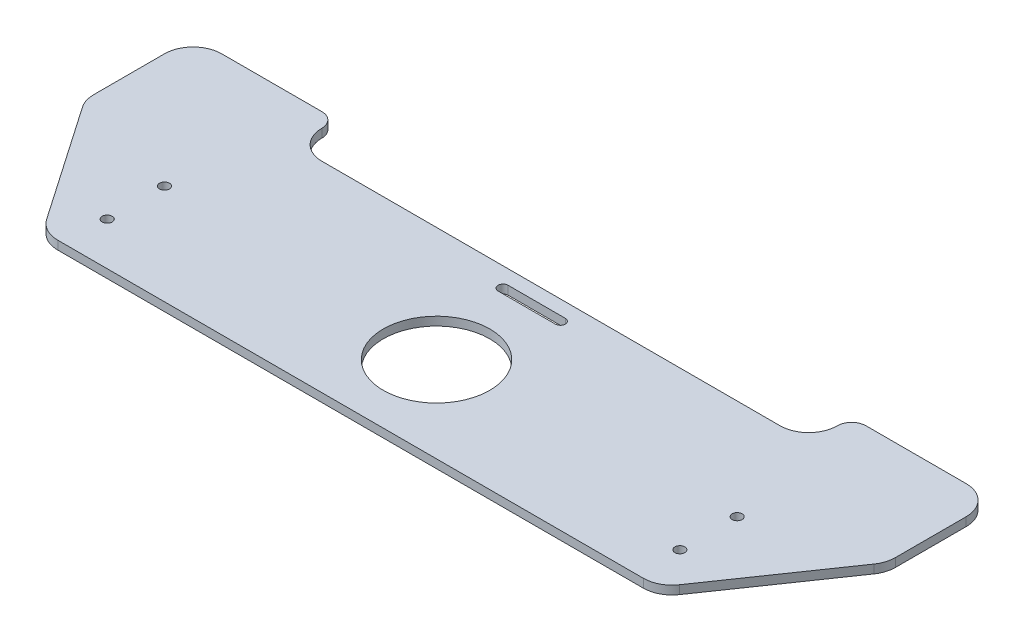
ISO-10303-21;
HEADER;
FILE_DESCRIPTION(('STEP AP214'),'2;1');
FILE_NAME('part.step','',(''),(''),'','','');
FILE_SCHEMA(('AUTOMOTIVE_DESIGN { 1 0 10303 214 1 1 1 1 }'));
ENDSEC;
DATA;
#1=APPLICATION_CONTEXT('core data for automotive mechanical design processes');
#2=APPLICATION_PROTOCOL_DEFINITION('international standard','automotive_design',2000,#1);
#3=PRODUCT_CONTEXT('',#1,'mechanical');
#4=PRODUCT('Part','Part','',(#3));
#5=PRODUCT_RELATED_PRODUCT_CATEGORY('part','',(#4));
#6=PRODUCT_DEFINITION_FORMATION('','',#4);
#7=PRODUCT_DEFINITION_CONTEXT('part definition',#1,'design');
#8=PRODUCT_DEFINITION('design','',#6,#7);
#9=PRODUCT_DEFINITION_SHAPE('','',#8);
#10=(LENGTH_UNIT() NAMED_UNIT(*) SI_UNIT(.MILLI.,.METRE.));
#11=(NAMED_UNIT(*) PLANE_ANGLE_UNIT() SI_UNIT($,.RADIAN.));
#12=(NAMED_UNIT(*) SI_UNIT($,.STERADIAN.) SOLID_ANGLE_UNIT());
#13=UNCERTAINTY_MEASURE_WITH_UNIT(LENGTH_MEASURE(1.E-05),#10,'distance_accuracy_value','');
#14=(GEOMETRIC_REPRESENTATION_CONTEXT(3) GLOBAL_UNCERTAINTY_ASSIGNED_CONTEXT((#13)) GLOBAL_UNIT_ASSIGNED_CONTEXT((#10,
#11,#12)) REPRESENTATION_CONTEXT('',''));
#15=CARTESIAN_POINT('',(0.,0.,0.));
#16=DIRECTION('',(0.,0.,1.));
#17=DIRECTION('',(1.,0.,0.));
#18=AXIS2_PLACEMENT_3D('',#15,#16,#17);
#19=CARTESIAN_POINT('',(102.256301560113,3.,15.0991936427521));
#20=DIRECTION('',(0.,-1.,0.));
#21=DIRECTION('',(0.,0.,-1.));
#22=AXIS2_PLACEMENT_3D('',#19,#20,#21);
#23=CYLINDRICAL_SURFACE('',#22,10.);
#24=CARTESIAN_POINT('',(102.256301560113,0.,15.0991936427521));
#25=DIRECTION('',(0.,1.,0.));
#26=DIRECTION('',(0.,0.,-1.));
#27=AXIS2_PLACEMENT_3D('',#24,#25,#26);
#28=CIRCLE('',#27,10.);
#29=CARTESIAN_POINT('',(102.256301560113,0.,25.0991936427522));
#30=VERTEX_POINT('',#29);
#31=CARTESIAN_POINT('',(110.492131082074,0.,20.7711520422125));
#32=VERTEX_POINT('',#31);
#33=EDGE_CURVE('E274',#30,#32,#28,.T.);
#34=ORIENTED_EDGE('',*,*,#33,.T.);
#35=DIRECTION('',(0.,-1.,0.));
#36=VECTOR('',#35,1.);
#37=CARTESIAN_POINT('',(110.492131082074,3.,20.7711520422125));
#38=LINE('',#37,#36);
#39=CARTESIAN_POINT('',(110.492131082074,3.,20.7711520422125));
#40=VERTEX_POINT('',#39);
#41=EDGE_CURVE('E332',#40,#32,#38,.T.);
#42=ORIENTED_EDGE('',*,*,#41,.F.);
#43=CARTESIAN_POINT('',(102.256301560113,3.,15.0991936427521));
#44=DIRECTION('',(0.,1.,0.));
#45=DIRECTION('',(0.,0.,-1.));
#46=AXIS2_PLACEMENT_3D('',#43,#44,#45);
#47=CIRCLE('',#46,10.);
#48=CARTESIAN_POINT('',(102.256301560113,3.,25.0991936427522));
#49=VERTEX_POINT('',#48);
#50=EDGE_CURVE('E245',#49,#40,#47,.T.);
#51=ORIENTED_EDGE('',*,*,#50,.F.);
#52=DIRECTION('',(0.,-1.,0.));
#53=VECTOR('',#52,1.);
#54=CARTESIAN_POINT('',(102.256301560113,3.,25.0991936427522));
#55=LINE('',#54,#53);
#56=EDGE_CURVE('E273',#49,#30,#55,.T.);
#57=ORIENTED_EDGE('',*,*,#56,.T.);
#58=EDGE_LOOP('',(#34,#42,#51,#57));
#59=FACE_BOUND('',#58,.T.);
#60=ADVANCED_FACE('F39',(#59),#23,.T.);
#61=CARTESIAN_POINT('',(138.23582952196,3.,-19.5134118716058));
#62=DIRECTION('',(-0.823582952196019,0.,-0.567195839946036));
#63=DIRECTION('',(-0.567195839946036,0.,0.823582952196019));
#64=AXIS2_PLACEMENT_3D('',#61,#62,#63);
#65=PLANE('',#64);
#66=DIRECTION('',(0.567195839946036,0.,-0.823582952196019));
#67=VECTOR('',#66,1.);
#68=CARTESIAN_POINT('',(138.23582952196,0.,-19.5134118716058));
#69=LINE('',#68,#67);
#70=CARTESIAN_POINT('',(138.23582952196,0.,-19.5134118716058));
#71=VERTEX_POINT('',#70);
#72=EDGE_CURVE('E277',#32,#71,#69,.T.);
#73=ORIENTED_EDGE('',*,*,#72,.T.);
#74=DIRECTION('',(0.,-1.,0.));
#75=VECTOR('',#74,1.);
#76=CARTESIAN_POINT('',(138.23582952196,3.,-19.5134118716058));
#77=LINE('',#76,#75);
#78=CARTESIAN_POINT('',(138.23582952196,3.,-19.5134118716058));
#79=VERTEX_POINT('',#78);
#80=EDGE_CURVE('E329',#79,#71,#77,.T.);
#81=ORIENTED_EDGE('',*,*,#80,.F.);
#82=DIRECTION('',(0.567195839946036,0.,-0.823582952196019));
#83=VECTOR('',#82,1.);
#84=CARTESIAN_POINT('',(138.23582952196,3.,-19.5134118716058));
#85=LINE('',#84,#83);
#86=EDGE_CURVE('E248',#40,#79,#85,.T.);
#87=ORIENTED_EDGE('',*,*,#86,.F.);
#88=ORIENTED_EDGE('',*,*,#41,.T.);
#89=EDGE_LOOP('',(#73,#81,#87,#88));
#90=FACE_BOUND('',#89,.T.);
#91=ADVANCED_FACE('F417',(#90),#65,.F.);
#92=CARTESIAN_POINT('',(130.,3.,-25.1853702710662));
#93=DIRECTION('',(0.,-1.,0.));
#94=DIRECTION('',(0.,0.,-1.));
#95=AXIS2_PLACEMENT_3D('',#92,#93,#94);
#96=CYLINDRICAL_SURFACE('',#95,10.);
#97=CARTESIAN_POINT('',(130.,0.,-25.1853702710662));
#98=DIRECTION('',(0.,1.,0.));
#99=DIRECTION('',(0.,0.,1.));
#100=AXIS2_PLACEMENT_3D('',#97,#98,#99);
#101=CIRCLE('',#100,10.);
#102=CARTESIAN_POINT('',(140.,0.,-25.1853702710662));
#103=VERTEX_POINT('',#102);
#104=EDGE_CURVE('E279',#71,#103,#101,.T.);
#105=ORIENTED_EDGE('',*,*,#104,.T.);
#106=DIRECTION('',(0.,-1.,0.));
#107=VECTOR('',#106,1.);
#108=CARTESIAN_POINT('',(140.,3.,-25.1853702710662));
#109=LINE('',#108,#107);
#110=CARTESIAN_POINT('',(140.,3.,-25.1853702710662));
#111=VERTEX_POINT('',#110);
#112=EDGE_CURVE('E326',#111,#103,#109,.T.);
#113=ORIENTED_EDGE('',*,*,#112,.F.);
#114=CARTESIAN_POINT('',(130.,3.,-25.1853702710662));
#115=DIRECTION('',(0.,1.,0.));
#116=DIRECTION('',(0.,0.,1.));
#117=AXIS2_PLACEMENT_3D('',#114,#115,#116);
#118=CIRCLE('',#117,10.);
#119=EDGE_CURVE('E251',#79,#111,#118,.T.);
#120=ORIENTED_EDGE('',*,*,#119,.F.);
#121=ORIENTED_EDGE('',*,*,#80,.T.);
#122=EDGE_LOOP('',(#105,#113,#120,#121));
#123=FACE_BOUND('',#122,.T.);
#124=ADVANCED_FACE('F411',(#123),#96,.T.);
#125=CARTESIAN_POINT('',(140.,3.,-25.1853702710662));
#126=DIRECTION('',(-1.,0.,0.));
#127=DIRECTION('',(0.,0.,1.));
#128=AXIS2_PLACEMENT_3D('',#125,#126,#127);
#129=PLANE('',#128);
#130=DIRECTION('',(0.,0.,-1.));
#131=VECTOR('',#130,1.);
#132=CARTESIAN_POINT('',(140.,0.,-25.1853702710662));
#133=LINE('',#132,#131);
#134=CARTESIAN_POINT('',(140.,0.,-49.9008063572478));
#135=VERTEX_POINT('',#134);
#136=EDGE_CURVE('E281',#103,#135,#133,.T.);
#137=ORIENTED_EDGE('',*,*,#136,.T.);
#138=DIRECTION('',(0.,1.,0.));
#139=VECTOR('',#138,1.);
#140=CARTESIAN_POINT('',(140.,3.,-49.9008063572478));
#141=LINE('',#140,#139);
#142=CARTESIAN_POINT('',(140.,3.,-49.9008063572478));
#143=VERTEX_POINT('',#142);
#144=EDGE_CURVE('E353',#135,#143,#141,.T.);
#145=ORIENTED_EDGE('',*,*,#144,.T.);
#146=DIRECTION('',(0.,0.,-1.));
#147=VECTOR('',#146,1.);
#148=CARTESIAN_POINT('',(140.,3.,-25.1853702710662));
#149=LINE('',#148,#147);
#150=EDGE_CURVE('E253',#111,#143,#149,.T.);
#151=ORIENTED_EDGE('',*,*,#150,.F.);
#152=ORIENTED_EDGE('',*,*,#112,.T.);
#153=EDGE_LOOP('',(#137,#145,#151,#152));
#154=FACE_BOUND('',#153,.T.);
#155=ADVANCED_FACE('F404',(#154),#129,.F.);
#156=CARTESIAN_POINT('',(80.,3.,-54.9008063572479));
#157=DIRECTION('',(0.,-1.,0.));
#158=DIRECTION('',(0.,0.,-1.));
#159=AXIS2_PLACEMENT_3D('',#156,#157,#158);
#160=CYLINDRICAL_SURFACE('',#159,10.);
#161=CARTESIAN_POINT('',(80.,0.,-54.9008063572479));
#162=DIRECTION('',(0.,-1.,0.));
#163=DIRECTION('',(0.,0.,-1.));
#164=AXIS2_PLACEMENT_3D('',#161,#162,#163);
#165=CIRCLE('',#164,10.);
#166=CARTESIAN_POINT('',(90.,0.,-54.9008063572479));
#167=VERTEX_POINT('',#166);
#168=CARTESIAN_POINT('',(80.,0.,-44.9008063572479));
#169=VERTEX_POINT('',#168);
#170=EDGE_CURVE('E284',#167,#169,#165,.T.);
#171=ORIENTED_EDGE('',*,*,#170,.T.);
#172=DIRECTION('',(0.,-1.,0.));
#173=VECTOR('',#172,1.);
#174=CARTESIAN_POINT('',(80.,3.,-44.9008063572479));
#175=LINE('',#174,#173);
#176=CARTESIAN_POINT('',(80.,3.,-44.9008063572479));
#177=VERTEX_POINT('',#176);
#178=EDGE_CURVE('E320',#177,#169,#175,.T.);
#179=ORIENTED_EDGE('',*,*,#178,.F.);
#180=CARTESIAN_POINT('',(80.,3.,-54.9008063572479));
#181=DIRECTION('',(0.,-1.,0.));
#182=DIRECTION('',(0.,0.,-1.));
#183=AXIS2_PLACEMENT_3D('',#180,#181,#182);
#184=CIRCLE('',#183,10.);
#185=CARTESIAN_POINT('',(90.,3.,-54.9008063572479));
#186=VERTEX_POINT('',#185);
#187=EDGE_CURVE('E256',#186,#177,#184,.T.);
#188=ORIENTED_EDGE('',*,*,#187,.F.);
#189=DIRECTION('',(0.,-1.,0.));
#190=VECTOR('',#189,1.);
#191=CARTESIAN_POINT('',(90.,3.,-54.9008063572479));
#192=LINE('',#191,#190);
#193=EDGE_CURVE('E323',#186,#167,#192,.T.);
#194=ORIENTED_EDGE('',*,*,#193,.T.);
#195=EDGE_LOOP('',(#171,#179,#188,#194));
#196=FACE_BOUND('',#195,.T.);
#197=ADVANCED_FACE('F467',(#196),#160,.F.);
#198=CARTESIAN_POINT('',(-80.,3.,-44.9008063572479));
#199=DIRECTION('',(0.,0.,1.));
#200=DIRECTION('',(1.,0.,0.));
#201=AXIS2_PLACEMENT_3D('',#198,#199,#200);
#202=PLANE('',#201);
#203=DIRECTION('',(-1.,0.,0.));
#204=VECTOR('',#203,1.);
#205=CARTESIAN_POINT('',(-80.,0.,-44.9008063572479));
#206=LINE('',#205,#204);
#207=CARTESIAN_POINT('',(-80.,0.,-44.9008063572479));
#208=VERTEX_POINT('',#207);
#209=EDGE_CURVE('E286',#169,#208,#206,.T.);
#210=ORIENTED_EDGE('',*,*,#209,.T.);
#211=DIRECTION('',(0.,-1.,0.));
#212=VECTOR('',#211,1.);
#213=CARTESIAN_POINT('',(-80.,3.,-44.9008063572479));
#214=LINE('',#213,#212);
#215=CARTESIAN_POINT('',(-80.,3.,-44.9008063572479));
#216=VERTEX_POINT('',#215);
#217=EDGE_CURVE('E317',#216,#208,#214,.T.);
#218=ORIENTED_EDGE('',*,*,#217,.F.);
#219=DIRECTION('',(-1.,0.,0.));
#220=VECTOR('',#219,1.);
#221=CARTESIAN_POINT('',(-80.,3.,-44.9008063572479));
#222=LINE('',#221,#220);
#223=EDGE_CURVE('E258',#177,#216,#222,.T.);
#224=ORIENTED_EDGE('',*,*,#223,.F.);
#225=ORIENTED_EDGE('',*,*,#178,.T.);
#226=EDGE_LOOP('',(#210,#218,#224,#225));
#227=FACE_BOUND('',#226,.T.);
#228=ADVANCED_FACE('F464',(#227),#202,.F.);
#229=CARTESIAN_POINT('',(-80.,3.,-54.9008063572479));
#230=DIRECTION('',(0.,-1.,0.));
#231=DIRECTION('',(0.,0.,-1.));
#232=AXIS2_PLACEMENT_3D('',#229,#230,#231);
#233=CYLINDRICAL_SURFACE('',#232,10.);
#234=CARTESIAN_POINT('',(-80.,0.,-54.9008063572479));
#235=DIRECTION('',(0.,-1.,0.));
#236=DIRECTION('',(0.,0.,1.));
#237=AXIS2_PLACEMENT_3D('',#234,#235,#236);
#238=CIRCLE('',#237,10.);
#239=CARTESIAN_POINT('',(-90.,0.,-54.9008063572479));
#240=VERTEX_POINT('',#239);
#241=EDGE_CURVE('E288',#208,#240,#238,.T.);
#242=ORIENTED_EDGE('',*,*,#241,.T.);
#243=DIRECTION('',(0.,-1.,0.));
#244=VECTOR('',#243,1.);
#245=CARTESIAN_POINT('',(-90.,3.,-54.9008063572479));
#246=LINE('',#245,#244);
#247=CARTESIAN_POINT('',(-90.,3.,-54.9008063572479));
#248=VERTEX_POINT('',#247);
#249=EDGE_CURVE('E314',#248,#240,#246,.T.);
#250=ORIENTED_EDGE('',*,*,#249,.F.);
#251=CARTESIAN_POINT('',(-80.,3.,-54.9008063572479));
#252=DIRECTION('',(0.,-1.,0.));
#253=DIRECTION('',(0.,0.,1.));
#254=AXIS2_PLACEMENT_3D('',#251,#252,#253);
#255=CIRCLE('',#254,10.);
#256=EDGE_CURVE('E260',#216,#248,#255,.T.);
#257=ORIENTED_EDGE('',*,*,#256,.F.);
#258=ORIENTED_EDGE('',*,*,#217,.T.);
#259=EDGE_LOOP('',(#242,#250,#257,#258));
#260=FACE_BOUND('',#259,.T.);
#261=ADVANCED_FACE('F460',(#260),#233,.F.);
#262=CARTESIAN_POINT('',(-140.,3.,-25.1853702710662));
#263=DIRECTION('',(1.,0.,0.));
#264=DIRECTION('',(0.,0.,-1.));
#265=AXIS2_PLACEMENT_3D('',#262,#263,#264);
#266=PLANE('',#265);
#267=DIRECTION('',(0.,0.,1.));
#268=VECTOR('',#267,1.);
#269=CARTESIAN_POINT('',(-140.,3.,-25.1853702710662));
#270=LINE('',#269,#268);
#271=CARTESIAN_POINT('',(-140.,3.,-49.9008063572478));
#272=VERTEX_POINT('',#271);
#273=CARTESIAN_POINT('',(-140.,3.,-25.1853702710662));
#274=VERTEX_POINT('',#273);
#275=EDGE_CURVE('E263',#272,#274,#270,.T.);
#276=ORIENTED_EDGE('',*,*,#275,.F.);
#277=DIRECTION('',(0.,-1.,0.));
#278=VECTOR('',#277,1.);
#279=CARTESIAN_POINT('',(-140.,3.,-49.9008063572478));
#280=LINE('',#279,#278);
#281=CARTESIAN_POINT('',(-140.,0.,-49.9008063572478));
#282=VERTEX_POINT('',#281);
#283=EDGE_CURVE('E48',#272,#282,#280,.T.);
#284=ORIENTED_EDGE('',*,*,#283,.T.);
#285=DIRECTION('',(0.,0.,1.));
#286=VECTOR('',#285,1.);
#287=CARTESIAN_POINT('',(-140.,0.,-25.1853702710662));
#288=LINE('',#287,#286);
#289=CARTESIAN_POINT('',(-140.,0.,-25.1853702710662));
#290=VERTEX_POINT('',#289);
#291=EDGE_CURVE('E291',#282,#290,#288,.T.);
#292=ORIENTED_EDGE('',*,*,#291,.T.);
#293=DIRECTION('',(0.,-1.,0.));
#294=VECTOR('',#293,1.);
#295=CARTESIAN_POINT('',(-140.,3.,-25.1853702710662));
#296=LINE('',#295,#294);
#297=EDGE_CURVE('E311',#274,#290,#296,.T.);
#298=ORIENTED_EDGE('',*,*,#297,.F.);
#299=EDGE_LOOP('',(#276,#284,#292,#298));
#300=FACE_BOUND('',#299,.T.);
#301=ADVANCED_FACE('F444',(#300),#266,.F.);
#302=CARTESIAN_POINT('',(-130.,3.,-25.1853702710662));
#303=DIRECTION('',(0.,-1.,0.));
#304=DIRECTION('',(0.,0.,-1.));
#305=AXIS2_PLACEMENT_3D('',#302,#303,#304);
#306=CYLINDRICAL_SURFACE('',#305,10.);
#307=CARTESIAN_POINT('',(-130.,0.,-25.1853702710662));
#308=DIRECTION('',(0.,1.,0.));
#309=DIRECTION('',(0.,0.,-1.));
#310=AXIS2_PLACEMENT_3D('',#307,#308,#309);
#311=CIRCLE('',#310,10.);
#312=CARTESIAN_POINT('',(-138.23582952196,0.,-19.5134118716058));
#313=VERTEX_POINT('',#312);
#314=EDGE_CURVE('E293',#290,#313,#311,.T.);
#315=ORIENTED_EDGE('',*,*,#314,.T.);
#316=DIRECTION('',(0.,-1.,0.));
#317=VECTOR('',#316,1.);
#318=CARTESIAN_POINT('',(-138.23582952196,3.,-19.5134118716058));
#319=LINE('',#318,#317);
#320=CARTESIAN_POINT('',(-138.23582952196,3.,-19.5134118716058));
#321=VERTEX_POINT('',#320);
#322=EDGE_CURVE('E308',#321,#313,#319,.T.);
#323=ORIENTED_EDGE('',*,*,#322,.F.);
#324=CARTESIAN_POINT('',(-130.,3.,-25.1853702710662));
#325=DIRECTION('',(0.,1.,0.));
#326=DIRECTION('',(0.,0.,-1.));
#327=AXIS2_PLACEMENT_3D('',#324,#325,#326);
#328=CIRCLE('',#327,10.);
#329=EDGE_CURVE('E265',#274,#321,#328,.T.);
#330=ORIENTED_EDGE('',*,*,#329,.F.);
#331=ORIENTED_EDGE('',*,*,#297,.T.);
#332=EDGE_LOOP('',(#315,#323,#330,#331));
#333=FACE_BOUND('',#332,.T.);
#334=ADVANCED_FACE('F438',(#333),#306,.T.);
#335=CARTESIAN_POINT('',(-138.23582952196,3.,-19.5134118716058));
#336=DIRECTION('',(0.823582952196019,0.,-0.567195839946036));
#337=DIRECTION('',(-0.567195839946036,0.,-0.823582952196019));
#338=AXIS2_PLACEMENT_3D('',#335,#336,#337);
#339=PLANE('',#338);
#340=DIRECTION('',(0.567195839946036,0.,0.823582952196019));
#341=VECTOR('',#340,1.);
#342=CARTESIAN_POINT('',(-138.23582952196,0.,-19.5134118716058));
#343=LINE('',#342,#341);
#344=CARTESIAN_POINT('',(-110.492131082074,0.,20.7711520422125));
#345=VERTEX_POINT('',#344);
#346=EDGE_CURVE('E295',#313,#345,#343,.T.);
#347=ORIENTED_EDGE('',*,*,#346,.T.);
#348=DIRECTION('',(0.,-1.,0.));
#349=VECTOR('',#348,1.);
#350=CARTESIAN_POINT('',(-110.492131082074,3.,20.7711520422125));
#351=LINE('',#350,#349);
#352=CARTESIAN_POINT('',(-110.492131082074,3.,20.7711520422125));
#353=VERTEX_POINT('',#352);
#354=EDGE_CURVE('E305',#353,#345,#351,.T.);
#355=ORIENTED_EDGE('',*,*,#354,.F.);
#356=DIRECTION('',(0.567195839946036,0.,0.823582952196019));
#357=VECTOR('',#356,1.);
#358=CARTESIAN_POINT('',(-138.23582952196,3.,-19.5134118716058));
#359=LINE('',#358,#357);
#360=EDGE_CURVE('E267',#321,#353,#359,.T.);
#361=ORIENTED_EDGE('',*,*,#360,.F.);
#362=ORIENTED_EDGE('',*,*,#322,.T.);
#363=EDGE_LOOP('',(#347,#355,#361,#362));
#364=FACE_BOUND('',#363,.T.);
#365=ADVANCED_FACE('F434',(#364),#339,.F.);
#366=CARTESIAN_POINT('',(-102.256301560113,3.,15.0991936427521));
#367=DIRECTION('',(0.,-1.,0.));
#368=DIRECTION('',(0.,0.,-1.));
#369=AXIS2_PLACEMENT_3D('',#366,#367,#368);
#370=CYLINDRICAL_SURFACE('',#369,10.);
#371=CARTESIAN_POINT('',(-102.256301560113,0.,15.0991936427521));
#372=DIRECTION('',(0.,1.,0.));
#373=DIRECTION('',(0.,0.,1.));
#374=AXIS2_PLACEMENT_3D('',#371,#372,#373);
#375=CIRCLE('',#374,10.);
#376=CARTESIAN_POINT('',(-102.256301560113,0.,25.0991936427522));
#377=VERTEX_POINT('',#376);
#378=EDGE_CURVE('E297',#345,#377,#375,.T.);
#379=ORIENTED_EDGE('',*,*,#378,.T.);
#380=DIRECTION('',(0.,-1.,0.));
#381=VECTOR('',#380,1.);
#382=CARTESIAN_POINT('',(-102.256301560113,3.,25.0991936427522));
#383=LINE('',#382,#381);
#384=CARTESIAN_POINT('',(-102.256301560113,3.,25.0991936427522));
#385=VERTEX_POINT('',#384);
#386=EDGE_CURVE('E302',#385,#377,#383,.T.);
#387=ORIENTED_EDGE('',*,*,#386,.F.);
#388=CARTESIAN_POINT('',(-102.256301560113,3.,15.0991936427521));
#389=DIRECTION('',(0.,1.,0.));
#390=DIRECTION('',(0.,0.,1.));
#391=AXIS2_PLACEMENT_3D('',#388,#389,#390);
#392=CIRCLE('',#391,10.);
#393=EDGE_CURVE('E269',#353,#385,#392,.T.);
#394=ORIENTED_EDGE('',*,*,#393,.F.);
#395=ORIENTED_EDGE('',*,*,#354,.T.);
#396=EDGE_LOOP('',(#379,#387,#394,#395));
#397=FACE_BOUND('',#396,.T.);
#398=ADVANCED_FACE('F429',(#397),#370,.T.);
#399=CARTESIAN_POINT('',(-102.256301560113,3.,25.0991936427522));
#400=DIRECTION('',(0.,0.,-1.));
#401=DIRECTION('',(-1.,0.,0.));
#402=AXIS2_PLACEMENT_3D('',#399,#400,#401);
#403=PLANE('',#402);
#404=DIRECTION('',(1.,0.,0.));
#405=VECTOR('',#404,1.);
#406=CARTESIAN_POINT('',(-102.256301560113,0.,25.0991936427522));
#407=LINE('',#406,#405);
#408=EDGE_CURVE('E249',#377,#30,#407,.T.);
#409=ORIENTED_EDGE('',*,*,#408,.T.);
#410=ORIENTED_EDGE('',*,*,#56,.F.);
#411=DIRECTION('',(1.,0.,0.));
#412=VECTOR('',#411,1.);
#413=CARTESIAN_POINT('',(-102.256301560113,3.,25.0991936427522));
#414=LINE('',#413,#412);
#415=EDGE_CURVE('E271',#385,#49,#414,.T.);
#416=ORIENTED_EDGE('',*,*,#415,.F.);
#417=ORIENTED_EDGE('',*,*,#386,.T.);
#418=EDGE_LOOP('',(#409,#410,#416,#417));
#419=FACE_BOUND('',#418,.T.);
#420=ADVANCED_FACE('F423',(#419),#403,.F.);
#421=CARTESIAN_POINT('',(102.256301560113,3.,15.0991936427521));
#422=DIRECTION('',(0.,-1.,0.));
#423=DIRECTION('',(0.,0.,-1.));
#424=AXIS2_PLACEMENT_3D('',#421,#422,#423);
#425=PLANE('',#424);
#426=CARTESIAN_POINT('',(0.,3.,-4.91189021507715));
#427=DIRECTION('',(0.,-1.,0.));
#428=DIRECTION('',(0.,0.,-1.));
#429=AXIS2_PLACEMENT_3D('',#426,#427,#428);
#430=CIRCLE('',#429,18.5881097849225);
#431=CARTESIAN_POINT('',(0.,3.,-23.4999999999996));
#432=VERTEX_POINT('',#431);
#433=EDGE_CURVE('E213',#432,#432,#430,.T.);
#434=ORIENTED_EDGE('',*,*,#433,.T.);
#435=EDGE_LOOP('',(#434));
#436=FACE_BOUND('',#435,.T.);
#437=DIRECTION('',(1.,0.,0.));
#438=VECTOR('',#437,1.);
#439=CARTESIAN_POINT('',(-10.,3.,-36.4008063572479));
#440=LINE('',#439,#438);
#441=CARTESIAN_POINT('',(-10.,3.,-36.4008063572479));
#442=VERTEX_POINT('',#441);
#443=CARTESIAN_POINT('',(9.99999999999999,3.,-36.4008063572479));
#444=VERTEX_POINT('',#443);
#445=EDGE_CURVE('E219',#442,#444,#440,.T.);
#446=ORIENTED_EDGE('',*,*,#445,.F.);
#447=CARTESIAN_POINT('',(-10.,3.,-38.1508063572479));
#448=DIRECTION('',(0.,1.,0.));
#449=DIRECTION('',(0.,0.,1.));
#450=AXIS2_PLACEMENT_3D('',#447,#448,#449);
#451=CIRCLE('',#450,1.75000000000001);
#452=CARTESIAN_POINT('',(-10.,3.,-39.9008063572479));
#453=VERTEX_POINT('',#452);
#454=EDGE_CURVE('E56',#453,#442,#451,.T.);
#455=ORIENTED_EDGE('',*,*,#454,.F.);
#456=DIRECTION('',(-1.,0.,0.));
#457=VECTOR('',#456,1.);
#458=CARTESIAN_POINT('',(-10.,3.,-39.9008063572479));
#459=LINE('',#458,#457);
#460=CARTESIAN_POINT('',(9.99999999999999,3.,-39.9008063572479));
#461=VERTEX_POINT('',#460);
#462=EDGE_CURVE('E207',#461,#453,#459,.T.);
#463=ORIENTED_EDGE('',*,*,#462,.F.);
#464=CARTESIAN_POINT('',(9.99999999999999,3.,-38.1508063572479));
#465=DIRECTION('',(0.,1.,0.));
#466=DIRECTION('',(0.,0.,1.));
#467=AXIS2_PLACEMENT_3D('',#464,#465,#466);
#468=CIRCLE('',#467,1.75000000000001);
#469=EDGE_CURVE('E210',#444,#461,#468,.T.);
#470=ORIENTED_EDGE('',*,*,#469,.F.);
#471=EDGE_LOOP('',(#446,#455,#463,#470));
#472=FACE_BOUND('',#471,.T.);
#473=CARTESIAN_POINT('',(100.,3.,-9.90080635724784));
#474=DIRECTION('',(0.,1.,0.));
#475=DIRECTION('',(0.,0.,1.));
#476=AXIS2_PLACEMENT_3D('',#473,#474,#475);
#477=CIRCLE('',#476,1.75);
#478=CARTESIAN_POINT('',(100.,3.,-8.15080635724785));
#479=VERTEX_POINT('',#478);
#480=EDGE_CURVE('E232',#479,#479,#477,.T.);
#481=ORIENTED_EDGE('',*,*,#480,.F.);
#482=EDGE_LOOP('',(#481));
#483=FACE_BOUND('',#482,.T.);
#484=CARTESIAN_POINT('',(-99.9999999999999,3.,10.0991936427521));
#485=DIRECTION('',(0.,1.,0.));
#486=DIRECTION('',(0.,0.,1.));
#487=AXIS2_PLACEMENT_3D('',#484,#485,#486);
#488=CIRCLE('',#487,1.75);
#489=CARTESIAN_POINT('',(-99.9999999999999,3.,11.8491936427521));
#490=VERTEX_POINT('',#489);
#491=EDGE_CURVE('E231',#490,#490,#488,.T.);
#492=ORIENTED_EDGE('',*,*,#491,.F.);
#493=EDGE_LOOP('',(#492));
#494=FACE_BOUND('',#493,.T.);
#495=CARTESIAN_POINT('',(-99.9999999999999,3.,-9.90080635724786));
#496=DIRECTION('',(0.,1.,0.));
#497=DIRECTION('',(0.,0.,1.));
#498=AXIS2_PLACEMENT_3D('',#495,#496,#497);
#499=CIRCLE('',#498,1.75);
#500=CARTESIAN_POINT('',(-99.9999999999999,3.,-8.15080635724787));
#501=VERTEX_POINT('',#500);
#502=EDGE_CURVE('E225',#501,#501,#499,.T.);
#503=ORIENTED_EDGE('',*,*,#502,.F.);
#504=EDGE_LOOP('',(#503));
#505=FACE_BOUND('',#504,.T.);
#506=CARTESIAN_POINT('',(100.,3.,10.0991936427521));
#507=DIRECTION('',(0.,1.,0.));
#508=DIRECTION('',(0.,0.,1.));
#509=AXIS2_PLACEMENT_3D('',#506,#507,#508);
#510=CIRCLE('',#509,1.75);
#511=CARTESIAN_POINT('',(100.,3.,11.8491936427521));
#512=VERTEX_POINT('',#511);
#513=EDGE_CURVE('E235',#512,#512,#510,.T.);
#514=ORIENTED_EDGE('',*,*,#513,.F.);
#515=EDGE_LOOP('',(#514));
#516=FACE_BOUND('',#515,.T.);
#517=ORIENTED_EDGE('',*,*,#150,.T.);
#518=CARTESIAN_POINT('',(130.,3.,-49.9008063572478));
#519=DIRECTION('',(0.,-1.,0.));
#520=DIRECTION('',(0.,0.,-1.));
#521=AXIS2_PLACEMENT_3D('',#518,#519,#520);
#522=CIRCLE('',#521,10.);
#523=CARTESIAN_POINT('',(130.,3.,-59.9008063572478));
#524=VERTEX_POINT('',#523);
#525=EDGE_CURVE('E358',#143,#524,#522,.F.);
#526=ORIENTED_EDGE('',*,*,#525,.T.);
#527=DIRECTION('',(1.,0.,0.));
#528=VECTOR('',#527,1.);
#529=CARTESIAN_POINT('',(140.,3.,-59.9008063572478));
#530=LINE('',#529,#528);
#531=CARTESIAN_POINT('',(95.,3.,-59.9008063572478));
#532=VERTEX_POINT('',#531);
#533=EDGE_CURVE('E241',#532,#524,#530,.T.);
#534=ORIENTED_EDGE('',*,*,#533,.F.);
#535=CARTESIAN_POINT('',(95.,3.,-54.9008063572478));
#536=DIRECTION('',(0.,-1.,0.));
#537=DIRECTION('',(0.,0.,-1.));
#538=AXIS2_PLACEMENT_3D('',#535,#536,#537);
#539=CIRCLE('',#538,5.);
#540=EDGE_CURVE('E339',#532,#186,#539,.F.);
#541=ORIENTED_EDGE('',*,*,#540,.T.);
#542=ORIENTED_EDGE('',*,*,#187,.T.);
#543=ORIENTED_EDGE('',*,*,#223,.T.);
#544=ORIENTED_EDGE('',*,*,#256,.T.);
#545=CARTESIAN_POINT('',(-95.,3.,-54.9008063572478));
#546=DIRECTION('',(0.,-1.,0.));
#547=DIRECTION('',(0.,0.,-1.));
#548=AXIS2_PLACEMENT_3D('',#545,#546,#547);
#549=CIRCLE('',#548,5.);
#550=CARTESIAN_POINT('',(-95.,3.,-59.9008063572478));
#551=VERTEX_POINT('',#550);
#552=EDGE_CURVE('E341',#248,#551,#549,.F.);
#553=ORIENTED_EDGE('',*,*,#552,.T.);
#554=CARTESIAN_POINT('',(-130.,3.,-59.9008063572478));
#555=VERTEX_POINT('',#554);
#556=EDGE_CURVE('E244',#555,#551,#530,.T.);
#557=ORIENTED_EDGE('',*,*,#556,.F.);
#558=CARTESIAN_POINT('',(-130.,3.,-49.9008063572478));
#559=DIRECTION('',(0.,-1.,0.));
#560=DIRECTION('',(0.,0.,-1.));
#561=AXIS2_PLACEMENT_3D('',#558,#559,#560);
#562=CIRCLE('',#561,10.);
#563=EDGE_CURVE('E356',#555,#272,#562,.F.);
#564=ORIENTED_EDGE('',*,*,#563,.T.);
#565=ORIENTED_EDGE('',*,*,#275,.T.);
#566=ORIENTED_EDGE('',*,*,#329,.T.);
#567=ORIENTED_EDGE('',*,*,#360,.T.);
#568=ORIENTED_EDGE('',*,*,#393,.T.);
#569=ORIENTED_EDGE('',*,*,#415,.T.);
#570=ORIENTED_EDGE('',*,*,#50,.T.);
#571=ORIENTED_EDGE('',*,*,#86,.T.);
#572=ORIENTED_EDGE('',*,*,#119,.T.);
#573=EDGE_LOOP('',(#517,#526,#534,#541,#542,#543,#544,#553,#557,#564,#565,#566,#567,#568,#569,
#570,#571,#572));
#574=FACE_BOUND('',#573,.T.);
#575=ADVANCED_FACE('F384',(#436,#472,#483,#494,#505,#516,#574),#425,.F.);
#576=CARTESIAN_POINT('',(102.256301560113,0.,15.0991936427521));
#577=DIRECTION('',(0.,-1.,0.));
#578=DIRECTION('',(0.,0.,-1.));
#579=AXIS2_PLACEMENT_3D('',#576,#577,#578);
#580=PLANE('',#579);
#581=CARTESIAN_POINT('',(0.,0.,-4.91189021507715));
#582=DIRECTION('',(0.,-1.,0.));
#583=DIRECTION('',(0.,0.,-1.));
#584=AXIS2_PLACEMENT_3D('',#581,#582,#583);
#585=CIRCLE('',#584,18.5881097849225);
#586=CARTESIAN_POINT('',(0.,0.,-23.4999999999996));
#587=VERTEX_POINT('',#586);
#588=EDGE_CURVE('E533',#587,#587,#585,.T.);
#589=ORIENTED_EDGE('',*,*,#588,.F.);
#590=EDGE_LOOP('',(#589));
#591=FACE_BOUND('',#590,.T.);
#592=CARTESIAN_POINT('',(-10.,0.,-38.1508063572479));
#593=DIRECTION('',(0.,1.,0.));
#594=DIRECTION('',(0.,0.,1.));
#595=AXIS2_PLACEMENT_3D('',#592,#593,#594);
#596=CIRCLE('',#595,1.75000000000001);
#597=CARTESIAN_POINT('',(-10.,0.,-39.9008063572479));
#598=VERTEX_POINT('',#597);
#599=CARTESIAN_POINT('',(-10.,0.,-36.4008063572479));
#600=VERTEX_POINT('',#599);
#601=EDGE_CURVE('E191',#598,#600,#596,.T.);
#602=ORIENTED_EDGE('',*,*,#601,.T.);
#603=DIRECTION('',(1.,0.,0.));
#604=VECTOR('',#603,1.);
#605=CARTESIAN_POINT('',(-10.,0.,-36.4008063572479));
#606=LINE('',#605,#604);
#607=CARTESIAN_POINT('',(9.99999999999998,0.,-36.4008063572479));
#608=VERTEX_POINT('',#607);
#609=EDGE_CURVE('E200',#600,#608,#606,.T.);
#610=ORIENTED_EDGE('',*,*,#609,.T.);
#611=CARTESIAN_POINT('',(9.99999999999999,0.,-38.1508063572479));
#612=DIRECTION('',(0.,1.,0.));
#613=DIRECTION('',(0.,0.,1.));
#614=AXIS2_PLACEMENT_3D('',#611,#612,#613);
#615=CIRCLE('',#614,1.75000000000001);
#616=CARTESIAN_POINT('',(9.99999999999999,0.,-39.9008063572479));
#617=VERTEX_POINT('',#616);
#618=EDGE_CURVE('E64',#608,#617,#615,.T.);
#619=ORIENTED_EDGE('',*,*,#618,.T.);
#620=DIRECTION('',(-1.,0.,0.));
#621=VECTOR('',#620,1.);
#622=CARTESIAN_POINT('',(-10.,0.,-39.9008063572479));
#623=LINE('',#622,#621);
#624=EDGE_CURVE('E197',#617,#598,#623,.T.);
#625=ORIENTED_EDGE('',*,*,#624,.T.);
#626=EDGE_LOOP('',(#602,#610,#619,#625));
#627=FACE_BOUND('',#626,.T.);
#628=CARTESIAN_POINT('',(100.,0.,-9.90080635724784));
#629=DIRECTION('',(0.,-1.,0.));
#630=DIRECTION('',(0.,0.,-1.));
#631=AXIS2_PLACEMENT_3D('',#628,#629,#630);
#632=CIRCLE('',#631,1.75);
#633=CARTESIAN_POINT('',(100.,0.,-11.6508063572478));
#634=VERTEX_POINT('',#633);
#635=EDGE_CURVE('E43',#634,#634,#632,.T.);
#636=ORIENTED_EDGE('',*,*,#635,.F.);
#637=EDGE_LOOP('',(#636));
#638=FACE_BOUND('',#637,.T.);
#639=CARTESIAN_POINT('',(-99.9999999999999,0.,10.0991936427521));
#640=DIRECTION('',(0.,-1.,0.));
#641=DIRECTION('',(0.,0.,-1.));
#642=AXIS2_PLACEMENT_3D('',#639,#640,#641);
#643=CIRCLE('',#642,1.75);
#644=CARTESIAN_POINT('',(-99.9999999999999,0.,8.34919364275212));
#645=VERTEX_POINT('',#644);
#646=EDGE_CURVE('E372',#645,#645,#643,.T.);
#647=ORIENTED_EDGE('',*,*,#646,.F.);
#648=EDGE_LOOP('',(#647));
#649=FACE_BOUND('',#648,.T.);
#650=CARTESIAN_POINT('',(-99.9999999999999,0.,-9.90080635724786));
#651=DIRECTION('',(0.,-1.,0.));
#652=DIRECTION('',(0.,0.,-1.));
#653=AXIS2_PLACEMENT_3D('',#650,#651,#652);
#654=CIRCLE('',#653,1.75);
#655=CARTESIAN_POINT('',(-99.9999999999999,0.,-11.6508063572479));
#656=VERTEX_POINT('',#655);
#657=EDGE_CURVE('E370',#656,#656,#654,.T.);
#658=ORIENTED_EDGE('',*,*,#657,.F.);
#659=EDGE_LOOP('',(#658));
#660=FACE_BOUND('',#659,.T.);
#661=CARTESIAN_POINT('',(100.,0.,10.0991936427521));
#662=DIRECTION('',(0.,-1.,0.));
#663=DIRECTION('',(0.,0.,-1.));
#664=AXIS2_PLACEMENT_3D('',#661,#662,#663);
#665=CIRCLE('',#664,1.75);
#666=CARTESIAN_POINT('',(100.,0.,8.34919364275214));
#667=VERTEX_POINT('',#666);
#668=EDGE_CURVE('E240',#667,#667,#665,.T.);
#669=ORIENTED_EDGE('',*,*,#668,.F.);
#670=EDGE_LOOP('',(#669));
#671=FACE_BOUND('',#670,.T.);
#672=DIRECTION('',(-1.,0.,0.));
#673=VECTOR('',#672,1.);
#674=CARTESIAN_POINT('',(102.256301560113,0.,-59.9008063572478));
#675=LINE('',#674,#673);
#676=CARTESIAN_POINT('',(130.,0.,-59.9008063572478));
#677=VERTEX_POINT('',#676);
#678=CARTESIAN_POINT('',(95.,0.,-59.9008063572478));
#679=VERTEX_POINT('',#678);
#680=EDGE_CURVE('E338',#677,#679,#675,.T.);
#681=ORIENTED_EDGE('',*,*,#680,.F.);
#682=CARTESIAN_POINT('',(130.,0.,-49.9008063572478));
#683=DIRECTION('',(0.,-1.,0.));
#684=DIRECTION('',(0.,0.,-1.));
#685=AXIS2_PLACEMENT_3D('',#682,#683,#684);
#686=CIRCLE('',#685,10.);
#687=EDGE_CURVE('E364',#677,#135,#686,.T.);
#688=ORIENTED_EDGE('',*,*,#687,.T.);
#689=ORIENTED_EDGE('',*,*,#136,.F.);
#690=ORIENTED_EDGE('',*,*,#104,.F.);
#691=ORIENTED_EDGE('',*,*,#72,.F.);
#692=ORIENTED_EDGE('',*,*,#33,.F.);
#693=ORIENTED_EDGE('',*,*,#408,.F.);
#694=ORIENTED_EDGE('',*,*,#378,.F.);
#695=ORIENTED_EDGE('',*,*,#346,.F.);
#696=ORIENTED_EDGE('',*,*,#314,.F.);
#697=ORIENTED_EDGE('',*,*,#291,.F.);
#698=CARTESIAN_POINT('',(-130.,0.,-49.9008063572478));
#699=DIRECTION('',(0.,-1.,0.));
#700=DIRECTION('',(0.,0.,-1.));
#701=AXIS2_PLACEMENT_3D('',#698,#699,#700);
#702=CIRCLE('',#701,10.);
#703=CARTESIAN_POINT('',(-130.,0.,-59.9008063572478));
#704=VERTEX_POINT('',#703);
#705=EDGE_CURVE('E362',#282,#704,#702,.T.);
#706=ORIENTED_EDGE('',*,*,#705,.T.);
#707=CARTESIAN_POINT('',(-95.,0.,-59.9008063572478));
#708=VERTEX_POINT('',#707);
#709=EDGE_CURVE('E335',#708,#704,#675,.T.);
#710=ORIENTED_EDGE('',*,*,#709,.F.);
#711=CARTESIAN_POINT('',(-95.,0.,-54.9008063572478));
#712=DIRECTION('',(0.,-1.,0.));
#713=DIRECTION('',(0.,0.,-1.));
#714=AXIS2_PLACEMENT_3D('',#711,#712,#713);
#715=CIRCLE('',#714,5.);
#716=EDGE_CURVE('E349',#708,#240,#715,.T.);
#717=ORIENTED_EDGE('',*,*,#716,.T.);
#718=ORIENTED_EDGE('',*,*,#241,.F.);
#719=ORIENTED_EDGE('',*,*,#209,.F.);
#720=ORIENTED_EDGE('',*,*,#170,.F.);
#721=CARTESIAN_POINT('',(95.,0.,-54.9008063572478));
#722=DIRECTION('',(0.,-1.,0.));
#723=DIRECTION('',(0.,0.,-1.));
#724=AXIS2_PLACEMENT_3D('',#721,#722,#723);
#725=CIRCLE('',#724,5.);
#726=EDGE_CURVE('E346',#167,#679,#725,.T.);
#727=ORIENTED_EDGE('',*,*,#726,.T.);
#728=EDGE_LOOP('',(#681,#688,#689,#690,#691,#692,#693,#694,#695,#696,#697,#706,#710,#717,#718,
#719,#720,#727));
#729=FACE_BOUND('',#728,.T.);
#730=ADVANCED_FACE('F204',(#591,#627,#638,#649,#660,#671,#729),#580,.T.);
#731=CARTESIAN_POINT('',(140.,-15.,-59.9008063572478));
#732=DIRECTION('',(0.,0.,1.));
#733=DIRECTION('',(1.,0.,0.));
#734=AXIS2_PLACEMENT_3D('',#731,#732,#733);
#735=PLANE('',#734);
#736=ORIENTED_EDGE('',*,*,#709,.T.);
#737=DIRECTION('',(0.,-1.,0.));
#738=VECTOR('',#737,1.);
#739=CARTESIAN_POINT('',(-130.,-15.,-59.9008063572478));
#740=LINE('',#739,#738);
#741=EDGE_CURVE('E11',#704,#555,#740,.F.);
#742=ORIENTED_EDGE('',*,*,#741,.T.);
#743=ORIENTED_EDGE('',*,*,#556,.T.);
#744=DIRECTION('',(0.,1.,0.));
#745=VECTOR('',#744,1.);
#746=CARTESIAN_POINT('',(-95.,-15.,-59.9008063572478));
#747=LINE('',#746,#745);
#748=EDGE_CURVE('E344',#551,#708,#747,.F.);
#749=ORIENTED_EDGE('',*,*,#748,.T.);
#750=EDGE_LOOP('',(#736,#742,#743,#749));
#751=FACE_BOUND('',#750,.T.);
#752=ADVANCED_FACE('F383',(#751),#735,.F.);
#753=ORIENTED_EDGE('',*,*,#533,.T.);
#754=DIRECTION('',(0.,1.,0.));
#755=VECTOR('',#754,1.);
#756=CARTESIAN_POINT('',(130.,-15.,-59.9008063572478));
#757=LINE('',#756,#755);
#758=EDGE_CURVE('E360',#524,#677,#757,.F.);
#759=ORIENTED_EDGE('',*,*,#758,.T.);
#760=ORIENTED_EDGE('',*,*,#680,.T.);
#761=DIRECTION('',(0.,-1.,0.));
#762=VECTOR('',#761,1.);
#763=CARTESIAN_POINT('',(95.,-15.,-59.9008063572478));
#764=LINE('',#763,#762);
#765=EDGE_CURVE('E351',#679,#532,#764,.F.);
#766=ORIENTED_EDGE('',*,*,#765,.T.);
#767=EDGE_LOOP('',(#753,#759,#760,#766));
#768=FACE_BOUND('',#767,.T.);
#769=ADVANCED_FACE('F473',(#768),#735,.F.);
#770=CARTESIAN_POINT('',(-95.,3.,-54.9008063572478));
#771=DIRECTION('',(0.,1.,0.));
#772=DIRECTION('',(0.,0.,1.));
#773=AXIS2_PLACEMENT_3D('',#770,#771,#772);
#774=CYLINDRICAL_SURFACE('',#773,5.);
#775=ORIENTED_EDGE('',*,*,#716,.F.);
#776=ORIENTED_EDGE('',*,*,#748,.F.);
#777=ORIENTED_EDGE('',*,*,#552,.F.);
#778=ORIENTED_EDGE('',*,*,#249,.T.);
#779=EDGE_LOOP('',(#775,#776,#777,#778));
#780=FACE_BOUND('',#779,.T.);
#781=ADVANCED_FACE('F456',(#780),#774,.T.);
#782=CARTESIAN_POINT('',(95.,3.,-54.9008063572478));
#783=DIRECTION('',(0.,-1.,0.));
#784=DIRECTION('',(0.,0.,-1.));
#785=AXIS2_PLACEMENT_3D('',#782,#783,#784);
#786=CYLINDRICAL_SURFACE('',#785,5.);
#787=ORIENTED_EDGE('',*,*,#540,.F.);
#788=ORIENTED_EDGE('',*,*,#765,.F.);
#789=ORIENTED_EDGE('',*,*,#726,.F.);
#790=ORIENTED_EDGE('',*,*,#193,.F.);
#791=EDGE_LOOP('',(#787,#788,#789,#790));
#792=FACE_BOUND('',#791,.T.);
#793=ADVANCED_FACE('F472',(#792),#786,.T.);
#794=CARTESIAN_POINT('',(130.,3.,-49.9008063572478));
#795=DIRECTION('',(0.,1.,0.));
#796=DIRECTION('',(0.,0.,1.));
#797=AXIS2_PLACEMENT_3D('',#794,#795,#796);
#798=CYLINDRICAL_SURFACE('',#797,10.);
#799=ORIENTED_EDGE('',*,*,#687,.F.);
#800=ORIENTED_EDGE('',*,*,#758,.F.);
#801=ORIENTED_EDGE('',*,*,#525,.F.);
#802=ORIENTED_EDGE('',*,*,#144,.F.);
#803=EDGE_LOOP('',(#799,#800,#801,#802));
#804=FACE_BOUND('',#803,.T.);
#805=ADVANCED_FACE('F401',(#804),#798,.T.);
#806=CARTESIAN_POINT('',(-130.,3.,-49.9008063572478));
#807=DIRECTION('',(0.,-1.,0.));
#808=DIRECTION('',(0.,0.,-1.));
#809=AXIS2_PLACEMENT_3D('',#806,#807,#808);
#810=CYLINDRICAL_SURFACE('',#809,10.);
#811=ORIENTED_EDGE('',*,*,#563,.F.);
#812=ORIENTED_EDGE('',*,*,#741,.F.);
#813=ORIENTED_EDGE('',*,*,#705,.F.);
#814=ORIENTED_EDGE('',*,*,#283,.F.);
#815=EDGE_LOOP('',(#811,#812,#813,#814));
#816=FACE_BOUND('',#815,.T.);
#817=ADVANCED_FACE('F41',(#816),#810,.T.);
#818=CARTESIAN_POINT('',(100.,-15.,10.0991936427521));
#819=DIRECTION('',(0.,1.,0.));
#820=DIRECTION('',(0.,0.,1.));
#821=AXIS2_PLACEMENT_3D('',#818,#819,#820);
#822=CYLINDRICAL_SURFACE('',#821,1.75);
#823=ORIENTED_EDGE('',*,*,#668,.T.);
#824=EDGE_LOOP('',(#823));
#825=FACE_BOUND('',#824,.T.);
#826=ORIENTED_EDGE('',*,*,#513,.T.);
#827=EDGE_LOOP('',(#826));
#828=FACE_BOUND('',#827,.T.);
#829=ADVANCED_FACE('F496',(#825,#828),#822,.F.);
#830=CARTESIAN_POINT('',(-99.9999999999999,-15.,-9.90080635724786));
#831=DIRECTION('',(0.,1.,0.));
#832=DIRECTION('',(0.,0.,1.));
#833=AXIS2_PLACEMENT_3D('',#830,#831,#832);
#834=CYLINDRICAL_SURFACE('',#833,1.75);
#835=ORIENTED_EDGE('',*,*,#657,.T.);
#836=EDGE_LOOP('',(#835));
#837=FACE_BOUND('',#836,.T.);
#838=ORIENTED_EDGE('',*,*,#502,.T.);
#839=EDGE_LOOP('',(#838));
#840=FACE_BOUND('',#839,.T.);
#841=ADVANCED_FACE('F500',(#837,#840),#834,.F.);
#842=CARTESIAN_POINT('',(-99.9999999999999,-15.,10.0991936427521));
#843=DIRECTION('',(0.,1.,0.));
#844=DIRECTION('',(0.,0.,1.));
#845=AXIS2_PLACEMENT_3D('',#842,#843,#844);
#846=CYLINDRICAL_SURFACE('',#845,1.75);
#847=ORIENTED_EDGE('',*,*,#646,.T.);
#848=EDGE_LOOP('',(#847));
#849=FACE_BOUND('',#848,.T.);
#850=ORIENTED_EDGE('',*,*,#491,.T.);
#851=EDGE_LOOP('',(#850));
#852=FACE_BOUND('',#851,.T.);
#853=ADVANCED_FACE('F505',(#849,#852),#846,.F.);
#854=CARTESIAN_POINT('',(100.,-15.,-9.90080635724784));
#855=DIRECTION('',(0.,1.,0.));
#856=DIRECTION('',(0.,0.,1.));
#857=AXIS2_PLACEMENT_3D('',#854,#855,#856);
#858=CYLINDRICAL_SURFACE('',#857,1.75);
#859=ORIENTED_EDGE('',*,*,#635,.T.);
#860=EDGE_LOOP('',(#859));
#861=FACE_BOUND('',#860,.T.);
#862=ORIENTED_EDGE('',*,*,#480,.T.);
#863=EDGE_LOOP('',(#862));
#864=FACE_BOUND('',#863,.T.);
#865=ADVANCED_FACE('F379',(#861,#864),#858,.F.);
#866=CARTESIAN_POINT('',(-10.,0.,-38.1508063572479));
#867=DIRECTION('',(0.,1.,0.));
#868=DIRECTION('',(0.,0.,1.));
#869=AXIS2_PLACEMENT_3D('',#866,#867,#868);
#870=CYLINDRICAL_SURFACE('',#869,1.75000000000001);
#871=ORIENTED_EDGE('',*,*,#454,.T.);
#872=DIRECTION('',(0.,1.,0.));
#873=VECTOR('',#872,1.);
#874=CARTESIAN_POINT('',(-10.,0.,-36.4008063572479));
#875=LINE('',#874,#873);
#876=EDGE_CURVE('E187',#600,#442,#875,.T.);
#877=ORIENTED_EDGE('',*,*,#876,.F.);
#878=ORIENTED_EDGE('',*,*,#601,.F.);
#879=DIRECTION('',(0.,1.,0.));
#880=VECTOR('',#879,1.);
#881=CARTESIAN_POINT('',(-10.,0.,-39.9008063572479));
#882=LINE('',#881,#880);
#883=EDGE_CURVE('E223',#598,#453,#882,.T.);
#884=ORIENTED_EDGE('',*,*,#883,.T.);
#885=EDGE_LOOP('',(#871,#877,#878,#884));
#886=FACE_BOUND('',#885,.T.);
#887=ADVANCED_FACE('F189',(#886),#870,.F.);
#888=CARTESIAN_POINT('',(-10.,0.,-39.9008063572479));
#889=DIRECTION('',(0.,0.,-1.));
#890=DIRECTION('',(-1.,0.,0.));
#891=AXIS2_PLACEMENT_3D('',#888,#889,#890);
#892=PLANE('',#891);
#893=ORIENTED_EDGE('',*,*,#462,.T.);
#894=ORIENTED_EDGE('',*,*,#883,.F.);
#895=ORIENTED_EDGE('',*,*,#624,.F.);
#896=DIRECTION('',(0.,1.,0.));
#897=VECTOR('',#896,1.);
#898=CARTESIAN_POINT('',(9.99999999999999,0.,-39.9008063572479));
#899=LINE('',#898,#897);
#900=EDGE_CURVE('E226',#617,#461,#899,.T.);
#901=ORIENTED_EDGE('',*,*,#900,.T.);
#902=EDGE_LOOP('',(#893,#894,#895,#901));
#903=FACE_BOUND('',#902,.T.);
#904=ADVANCED_FACE('F516',(#903),#892,.F.);
#905=CARTESIAN_POINT('',(9.99999999999999,0.,-38.1508063572479));
#906=DIRECTION('',(0.,1.,0.));
#907=DIRECTION('',(0.,0.,1.));
#908=AXIS2_PLACEMENT_3D('',#905,#906,#907);
#909=CYLINDRICAL_SURFACE('',#908,1.75000000000001);
#910=ORIENTED_EDGE('',*,*,#469,.T.);
#911=ORIENTED_EDGE('',*,*,#900,.F.);
#912=ORIENTED_EDGE('',*,*,#618,.F.);
#913=DIRECTION('',(0.,1.,0.));
#914=VECTOR('',#913,1.);
#915=CARTESIAN_POINT('',(9.99999999999999,0.,-36.4008063572479));
#916=LINE('',#915,#914);
#917=EDGE_CURVE('E196',#608,#444,#916,.T.);
#918=ORIENTED_EDGE('',*,*,#917,.T.);
#919=EDGE_LOOP('',(#910,#911,#912,#918));
#920=FACE_BOUND('',#919,.T.);
#921=ADVANCED_FACE('F520',(#920),#909,.F.);
#922=CARTESIAN_POINT('',(-10.,0.,-36.4008063572479));
#923=DIRECTION('',(0.,0.,1.));
#924=DIRECTION('',(1.,0.,0.));
#925=AXIS2_PLACEMENT_3D('',#922,#923,#924);
#926=PLANE('',#925);
#927=ORIENTED_EDGE('',*,*,#445,.T.);
#928=ORIENTED_EDGE('',*,*,#917,.F.);
#929=ORIENTED_EDGE('',*,*,#609,.F.);
#930=ORIENTED_EDGE('',*,*,#876,.T.);
#931=EDGE_LOOP('',(#927,#928,#929,#930));
#932=FACE_BOUND('',#931,.T.);
#933=ADVANCED_FACE('F201',(#932),#926,.F.);
#934=CARTESIAN_POINT('',(0.,10.,-4.91189021507715));
#935=DIRECTION('',(0.,-1.,0.));
#936=DIRECTION('',(0.,0.,-1.));
#937=AXIS2_PLACEMENT_3D('',#934,#935,#936);
#938=CYLINDRICAL_SURFACE('',#937,18.5881097849225);
#939=ORIENTED_EDGE('',*,*,#588,.T.);
#940=EDGE_LOOP('',(#939));
#941=FACE_BOUND('',#940,.T.);
#942=ORIENTED_EDGE('',*,*,#433,.F.);
#943=EDGE_LOOP('',(#942));
#944=FACE_BOUND('',#943,.T.);
#945=ADVANCED_FACE('F519',(#941,#944),#938,.F.);
#946=CLOSED_SHELL('',(#60,#91,#124,#155,#197,#228,#261,#301,#334,#365,#398,#420,#575,#730,#752,
#769,#781,#793,#805,#817,#829,#841,#853,#865,#887,#904,#921,#933,#945));
#947=MANIFOLD_SOLID_BREP('B2',#946);
#948=ADVANCED_BREP_SHAPE_REPRESENTATION('',(#18,#947),#14);
#949=SHAPE_DEFINITION_REPRESENTATION(#9,#948);
ENDSEC;
END-ISO-10303-21;
